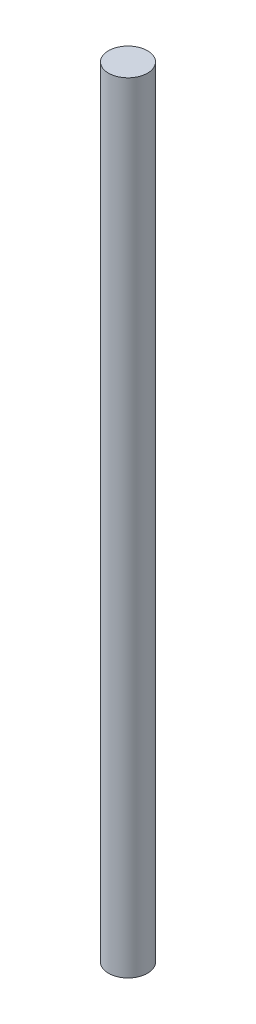
ISO-10303-21;
HEADER;
FILE_DESCRIPTION(('STEP AP214'),'2;1');
FILE_NAME('part.step','',(''),(''),'','','');
FILE_SCHEMA(('AUTOMOTIVE_DESIGN { 1 0 10303 214 1 1 1 1 }'));
ENDSEC;
DATA;
#1=APPLICATION_CONTEXT('core data for automotive mechanical design processes');
#2=APPLICATION_PROTOCOL_DEFINITION('international standard','automotive_design',2000,#1);
#3=PRODUCT_CONTEXT('',#1,'mechanical');
#4=PRODUCT('Part','Part','',(#3));
#5=PRODUCT_RELATED_PRODUCT_CATEGORY('part','',(#4));
#6=PRODUCT_DEFINITION_FORMATION('','',#4);
#7=PRODUCT_DEFINITION_CONTEXT('part definition',#1,'design');
#8=PRODUCT_DEFINITION('design','',#6,#7);
#9=PRODUCT_DEFINITION_SHAPE('','',#8);
#10=(LENGTH_UNIT() NAMED_UNIT(*) SI_UNIT(.MILLI.,.METRE.));
#11=(NAMED_UNIT(*) PLANE_ANGLE_UNIT() SI_UNIT($,.RADIAN.));
#12=(NAMED_UNIT(*) SI_UNIT($,.STERADIAN.) SOLID_ANGLE_UNIT());
#13=UNCERTAINTY_MEASURE_WITH_UNIT(LENGTH_MEASURE(1.E-05),#10,'distance_accuracy_value','');
#14=(GEOMETRIC_REPRESENTATION_CONTEXT(3) GLOBAL_UNCERTAINTY_ASSIGNED_CONTEXT((#13)) GLOBAL_UNIT_ASSIGNED_CONTEXT((#10,
#11,#12)) REPRESENTATION_CONTEXT('',''));
#15=CARTESIAN_POINT('',(0.,0.,0.));
#16=DIRECTION('',(0.,0.,1.));
#17=DIRECTION('',(1.,0.,0.));
#18=AXIS2_PLACEMENT_3D('',#15,#16,#17);
#19=CARTESIAN_POINT('',(0.,20.,0.));
#20=DIRECTION('',(0.,-1.,0.));
#21=DIRECTION('',(0.,0.,-1.));
#22=AXIS2_PLACEMENT_3D('',#19,#20,#21);
#23=CYLINDRICAL_SURFACE('',#22,0.5);
#24=CARTESIAN_POINT('',(0.,20.,0.));
#25=DIRECTION('',(0.,1.,0.));
#26=DIRECTION('',(0.,0.,1.));
#27=AXIS2_PLACEMENT_3D('',#24,#25,#26);
#28=CIRCLE('',#27,0.5);
#29=CARTESIAN_POINT('',(0.,20.,0.5));
#30=VERTEX_POINT('',#29);
#31=EDGE_CURVE('E10',#30,#30,#28,.T.);
#32=ORIENTED_EDGE('',*,*,#31,.F.);
#33=EDGE_LOOP('',(#32));
#34=FACE_BOUND('',#33,.T.);
#35=CARTESIAN_POINT('',(0.,0.,0.));
#36=DIRECTION('',(0.,1.,0.));
#37=DIRECTION('',(0.,0.,1.));
#38=AXIS2_PLACEMENT_3D('',#35,#36,#37);
#39=CIRCLE('',#38,0.5);
#40=CARTESIAN_POINT('',(0.,0.,0.5));
#41=VERTEX_POINT('',#40);
#42=EDGE_CURVE('E46',#41,#41,#39,.T.);
#43=ORIENTED_EDGE('',*,*,#42,.T.);
#44=EDGE_LOOP('',(#43));
#45=FACE_BOUND('',#44,.T.);
#46=ADVANCED_FACE('F43',(#34,#45),#23,.T.);
#47=CARTESIAN_POINT('',(0.,20.,0.));
#48=DIRECTION('',(0.,1.,0.));
#49=DIRECTION('',(0.,0.,1.));
#50=AXIS2_PLACEMENT_3D('',#47,#48,#49);
#51=PLANE('',#50);
#52=ORIENTED_EDGE('',*,*,#31,.T.);
#53=EDGE_LOOP('',(#52));
#54=FACE_BOUND('',#53,.T.);
#55=ADVANCED_FACE('F60',(#54),#51,.T.);
#56=CARTESIAN_POINT('',(0.,0.,0.));
#57=DIRECTION('',(0.,1.,0.));
#58=DIRECTION('',(0.,0.,1.));
#59=AXIS2_PLACEMENT_3D('',#56,#57,#58);
#60=PLANE('',#59);
#61=ORIENTED_EDGE('',*,*,#42,.F.);
#62=EDGE_LOOP('',(#61));
#63=FACE_BOUND('',#62,.T.);
#64=ADVANCED_FACE('F58',(#63),#60,.F.);
#65=CLOSED_SHELL('',(#46,#55,#64));
#66=MANIFOLD_SOLID_BREP('B2',#65);
#67=ADVANCED_BREP_SHAPE_REPRESENTATION('',(#18,#66),#14);
#68=SHAPE_DEFINITION_REPRESENTATION(#9,#67);
ENDSEC;
END-ISO-10303-21;
